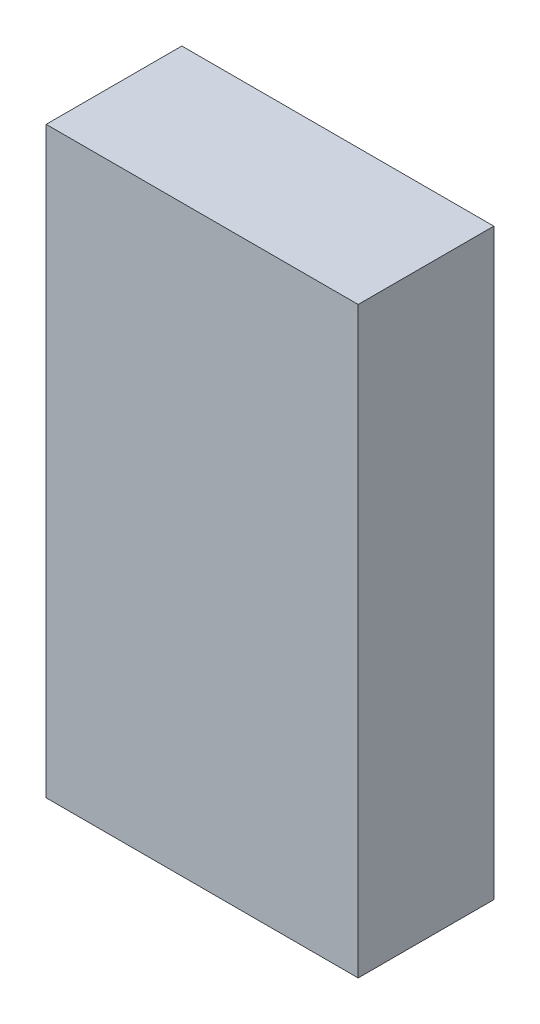
ISO-10303-21;
HEADER;
FILE_DESCRIPTION(('STEP AP214'),'2;1');
FILE_NAME('part.step','',(''),(''),'','','');
FILE_SCHEMA(('AUTOMOTIVE_DESIGN { 1 0 10303 214 1 1 1 1 }'));
ENDSEC;
DATA;
#1=APPLICATION_CONTEXT('core data for automotive mechanical design processes');
#2=APPLICATION_PROTOCOL_DEFINITION('international standard','automotive_design',2000,#1);
#3=PRODUCT_CONTEXT('',#1,'mechanical');
#4=PRODUCT('Part','Part','',(#3));
#5=PRODUCT_RELATED_PRODUCT_CATEGORY('part','',(#4));
#6=PRODUCT_DEFINITION_FORMATION('','',#4);
#7=PRODUCT_DEFINITION_CONTEXT('part definition',#1,'design');
#8=PRODUCT_DEFINITION('design','',#6,#7);
#9=PRODUCT_DEFINITION_SHAPE('','',#8);
#10=(LENGTH_UNIT() NAMED_UNIT(*) SI_UNIT(.MILLI.,.METRE.));
#11=(NAMED_UNIT(*) PLANE_ANGLE_UNIT() SI_UNIT($,.RADIAN.));
#12=(NAMED_UNIT(*) SI_UNIT($,.STERADIAN.) SOLID_ANGLE_UNIT());
#13=UNCERTAINTY_MEASURE_WITH_UNIT(LENGTH_MEASURE(1.E-05),#10,'distance_accuracy_value','');
#14=(GEOMETRIC_REPRESENTATION_CONTEXT(3) GLOBAL_UNCERTAINTY_ASSIGNED_CONTEXT((#13)) GLOBAL_UNIT_ASSIGNED_CONTEXT((#10,
#11,#12)) REPRESENTATION_CONTEXT('',''));
#15=CARTESIAN_POINT('',(0.,0.,0.));
#16=DIRECTION('',(0.,0.,1.));
#17=DIRECTION('',(1.,0.,0.));
#18=AXIS2_PLACEMENT_3D('',#15,#16,#17);
#19=CARTESIAN_POINT('',(0.,0.,50.));
#20=DIRECTION('',(1.,0.,0.));
#21=DIRECTION('',(0.,0.,-1.));
#22=AXIS2_PLACEMENT_3D('',#19,#20,#21);
#23=PLANE('',#22);
#24=DIRECTION('',(0.,-1.,0.));
#25=VECTOR('',#24,1.);
#26=CARTESIAN_POINT('',(0.,0.,0.));
#27=LINE('',#26,#25);
#28=CARTESIAN_POINT('',(0.,215.,0.));
#29=VERTEX_POINT('',#28);
#30=CARTESIAN_POINT('',(0.,0.,0.));
#31=VERTEX_POINT('',#30);
#32=EDGE_CURVE('E96',#29,#31,#27,.T.);
#33=ORIENTED_EDGE('',*,*,#32,.T.);
#34=DIRECTION('',(0.,0.,-1.));
#35=VECTOR('',#34,1.);
#36=CARTESIAN_POINT('',(0.,0.,50.));
#37=LINE('',#36,#35);
#38=CARTESIAN_POINT('',(0.,0.,50.));
#39=VERTEX_POINT('',#38);
#40=EDGE_CURVE('E11',#39,#31,#37,.T.);
#41=ORIENTED_EDGE('',*,*,#40,.F.);
#42=DIRECTION('',(0.,-1.,0.));
#43=VECTOR('',#42,1.);
#44=CARTESIAN_POINT('',(0.,0.,50.));
#45=LINE('',#44,#43);
#46=CARTESIAN_POINT('',(0.,215.,50.));
#47=VERTEX_POINT('',#46);
#48=EDGE_CURVE('E84',#47,#39,#45,.T.);
#49=ORIENTED_EDGE('',*,*,#48,.F.);
#50=DIRECTION('',(0.,0.,-1.));
#51=VECTOR('',#50,1.);
#52=CARTESIAN_POINT('',(0.,215.,50.));
#53=LINE('',#52,#51);
#54=EDGE_CURVE('E92',#47,#29,#53,.T.);
#55=ORIENTED_EDGE('',*,*,#54,.T.);
#56=EDGE_LOOP('',(#33,#41,#49,#55));
#57=FACE_BOUND('',#56,.T.);
#58=ADVANCED_FACE('F33',(#57),#23,.F.);
#59=CARTESIAN_POINT('',(0.,0.,50.));
#60=DIRECTION('',(0.,1.,0.));
#61=DIRECTION('',(0.,0.,1.));
#62=AXIS2_PLACEMENT_3D('',#59,#60,#61);
#63=PLANE('',#62);
#64=DIRECTION('',(1.,0.,0.));
#65=VECTOR('',#64,1.);
#66=CARTESIAN_POINT('',(0.,0.,0.));
#67=LINE('',#66,#65);
#68=CARTESIAN_POINT('',(115.,0.,0.));
#69=VERTEX_POINT('',#68);
#70=EDGE_CURVE('E88',#31,#69,#67,.T.);
#71=ORIENTED_EDGE('',*,*,#70,.T.);
#72=DIRECTION('',(0.,0.,-1.));
#73=VECTOR('',#72,1.);
#74=CARTESIAN_POINT('',(115.,0.,50.));
#75=LINE('',#74,#73);
#76=CARTESIAN_POINT('',(115.,0.,50.));
#77=VERTEX_POINT('',#76);
#78=EDGE_CURVE('E41',#77,#69,#75,.T.);
#79=ORIENTED_EDGE('',*,*,#78,.F.);
#80=DIRECTION('',(1.,0.,0.));
#81=VECTOR('',#80,1.);
#82=CARTESIAN_POINT('',(0.,0.,50.));
#83=LINE('',#82,#81);
#84=EDGE_CURVE('E79',#39,#77,#83,.T.);
#85=ORIENTED_EDGE('',*,*,#84,.F.);
#86=ORIENTED_EDGE('',*,*,#40,.T.);
#87=EDGE_LOOP('',(#71,#79,#85,#86));
#88=FACE_BOUND('',#87,.T.);
#89=ADVANCED_FACE('F87',(#88),#63,.F.);
#90=CARTESIAN_POINT('',(115.,0.,50.));
#91=DIRECTION('',(-1.,0.,0.));
#92=DIRECTION('',(0.,0.,1.));
#93=AXIS2_PLACEMENT_3D('',#90,#91,#92);
#94=PLANE('',#93);
#95=DIRECTION('',(0.,1.,0.));
#96=VECTOR('',#95,1.);
#97=CARTESIAN_POINT('',(115.,0.,0.));
#98=LINE('',#97,#96);
#99=CARTESIAN_POINT('',(115.,215.,0.));
#100=VERTEX_POINT('',#99);
#101=EDGE_CURVE('E66',#69,#100,#98,.T.);
#102=ORIENTED_EDGE('',*,*,#101,.T.);
#103=DIRECTION('',(0.,0.,-1.));
#104=VECTOR('',#103,1.);
#105=CARTESIAN_POINT('',(115.,215.,50.));
#106=LINE('',#105,#104);
#107=CARTESIAN_POINT('',(115.,215.,50.));
#108=VERTEX_POINT('',#107);
#109=EDGE_CURVE('E89',#108,#100,#106,.T.);
#110=ORIENTED_EDGE('',*,*,#109,.F.);
#111=DIRECTION('',(0.,1.,0.));
#112=VECTOR('',#111,1.);
#113=CARTESIAN_POINT('',(115.,0.,50.));
#114=LINE('',#113,#112);
#115=EDGE_CURVE('E82',#77,#108,#114,.T.);
#116=ORIENTED_EDGE('',*,*,#115,.F.);
#117=ORIENTED_EDGE('',*,*,#78,.T.);
#118=EDGE_LOOP('',(#102,#110,#116,#117));
#119=FACE_BOUND('',#118,.T.);
#120=ADVANCED_FACE('F90',(#119),#94,.F.);
#121=CARTESIAN_POINT('',(0.,215.,50.));
#122=DIRECTION('',(0.,-1.,0.));
#123=DIRECTION('',(0.,0.,-1.));
#124=AXIS2_PLACEMENT_3D('',#121,#122,#123);
#125=PLANE('',#124);
#126=DIRECTION('',(-1.,0.,0.));
#127=VECTOR('',#126,1.);
#128=CARTESIAN_POINT('',(0.,215.,0.));
#129=LINE('',#128,#127);
#130=EDGE_CURVE('E72',#100,#29,#129,.T.);
#131=ORIENTED_EDGE('',*,*,#130,.T.);
#132=ORIENTED_EDGE('',*,*,#54,.F.);
#133=DIRECTION('',(-1.,0.,0.));
#134=VECTOR('',#133,1.);
#135=CARTESIAN_POINT('',(0.,215.,50.));
#136=LINE('',#135,#134);
#137=EDGE_CURVE('E49',#108,#47,#136,.T.);
#138=ORIENTED_EDGE('',*,*,#137,.F.);
#139=ORIENTED_EDGE('',*,*,#109,.T.);
#140=EDGE_LOOP('',(#131,#132,#138,#139));
#141=FACE_BOUND('',#140,.T.);
#142=ADVANCED_FACE('F103',(#141),#125,.F.);
#143=CARTESIAN_POINT('',(0.,0.,50.));
#144=DIRECTION('',(0.,0.,-1.));
#145=DIRECTION('',(-1.,0.,0.));
#146=AXIS2_PLACEMENT_3D('',#143,#144,#145);
#147=PLANE('',#146);
#148=ORIENTED_EDGE('',*,*,#48,.T.);
#149=ORIENTED_EDGE('',*,*,#84,.T.);
#150=ORIENTED_EDGE('',*,*,#115,.T.);
#151=ORIENTED_EDGE('',*,*,#137,.T.);
#152=EDGE_LOOP('',(#148,#149,#150,#151));
#153=FACE_BOUND('',#152,.T.);
#154=ADVANCED_FACE('F80',(#153),#147,.F.);
#155=CARTESIAN_POINT('',(0.,0.,0.));
#156=DIRECTION('',(0.,0.,-1.));
#157=DIRECTION('',(-1.,0.,0.));
#158=AXIS2_PLACEMENT_3D('',#155,#156,#157);
#159=PLANE('',#158);
#160=ORIENTED_EDGE('',*,*,#32,.F.);
#161=ORIENTED_EDGE('',*,*,#130,.F.);
#162=ORIENTED_EDGE('',*,*,#101,.F.);
#163=ORIENTED_EDGE('',*,*,#70,.F.);
#164=EDGE_LOOP('',(#160,#161,#162,#163));
#165=FACE_BOUND('',#164,.T.);
#166=ADVANCED_FACE('F106',(#165),#159,.T.);
#167=CLOSED_SHELL('',(#58,#89,#120,#142,#154,#166));
#168=MANIFOLD_SOLID_BREP('B2',#167);
#169=ADVANCED_BREP_SHAPE_REPRESENTATION('',(#18,#168),#14);
#170=SHAPE_DEFINITION_REPRESENTATION(#9,#169);
ENDSEC;
END-ISO-10303-21;
